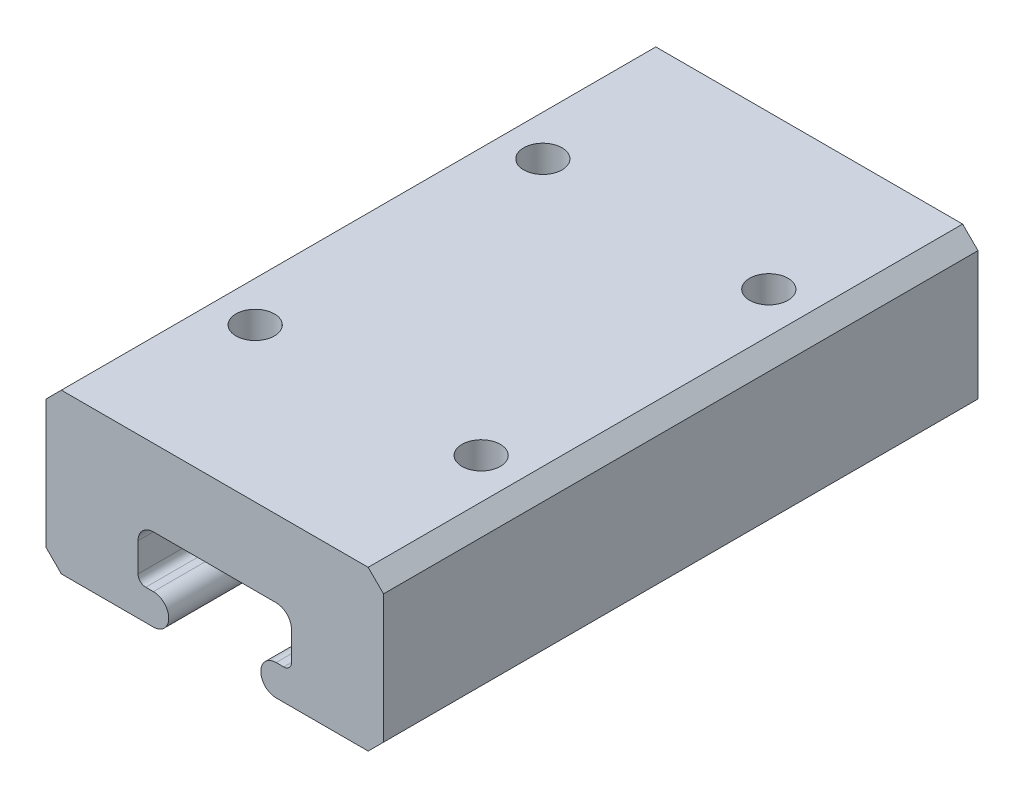
ISO-10303-21;
HEADER;
FILE_DESCRIPTION(('STEP AP214'),'2;1');
FILE_NAME('part.step','',(''),(''),'','','');
FILE_SCHEMA(('AUTOMOTIVE_DESIGN { 1 0 10303 214 1 1 1 1 }'));
ENDSEC;
DATA;
#1=APPLICATION_CONTEXT('core data for automotive mechanical design processes');
#2=APPLICATION_PROTOCOL_DEFINITION('international standard','automotive_design',2000,#1);
#3=PRODUCT_CONTEXT('',#1,'mechanical');
#4=PRODUCT('Part','Part','',(#3));
#5=PRODUCT_RELATED_PRODUCT_CATEGORY('part','',(#4));
#6=PRODUCT_DEFINITION_FORMATION('','',#4);
#7=PRODUCT_DEFINITION_CONTEXT('part definition',#1,'design');
#8=PRODUCT_DEFINITION('design','',#6,#7);
#9=PRODUCT_DEFINITION_SHAPE('','',#8);
#10=(LENGTH_UNIT() NAMED_UNIT(*) SI_UNIT(.MILLI.,.METRE.));
#11=(NAMED_UNIT(*) PLANE_ANGLE_UNIT() SI_UNIT($,.RADIAN.));
#12=(NAMED_UNIT(*) SI_UNIT($,.STERADIAN.) SOLID_ANGLE_UNIT());
#13=UNCERTAINTY_MEASURE_WITH_UNIT(LENGTH_MEASURE(1.E-05),#10,'distance_accuracy_value','');
#14=(GEOMETRIC_REPRESENTATION_CONTEXT(3) GLOBAL_UNCERTAINTY_ASSIGNED_CONTEXT((#13)) GLOBAL_UNIT_ASSIGNED_CONTEXT((#10,
#11,#12)) REPRESENTATION_CONTEXT('',''));
#15=CARTESIAN_POINT('',(0.,0.,0.));
#16=DIRECTION('',(0.,0.,1.));
#17=DIRECTION('',(1.,0.,0.));
#18=AXIS2_PLACEMENT_3D('',#15,#16,#17);
#19=CARTESIAN_POINT('',(8.,6.75,77.5));
#20=DIRECTION('',(0.,0.,-1.));
#21=DIRECTION('',(-1.,0.,0.));
#22=AXIS2_PLACEMENT_3D('',#19,#20,#21);
#23=CYLINDRICAL_SURFACE('',#22,2.);
#24=CARTESIAN_POINT('',(8.,6.75,0.));
#25=DIRECTION('',(0.,0.,-1.));
#26=DIRECTION('',(1.,0.,0.));
#27=AXIS2_PLACEMENT_3D('',#24,#25,#26);
#28=CIRCLE('',#27,2.);
#29=CARTESIAN_POINT('',(7.99999999999998,8.75,0.));
#30=VERTEX_POINT('',#29);
#31=CARTESIAN_POINT('',(10.,6.74999999999999,0.));
#32=VERTEX_POINT('',#31);
#33=EDGE_CURVE('E211',#30,#32,#28,.T.);
#34=ORIENTED_EDGE('',*,*,#33,.T.);
#35=DIRECTION('',(0.,0.,-1.));
#36=VECTOR('',#35,1.);
#37=CARTESIAN_POINT('',(10.,6.74999999999999,77.5));
#38=LINE('',#37,#36);
#39=CARTESIAN_POINT('',(10.,6.74999999999999,77.5));
#40=VERTEX_POINT('',#39);
#41=EDGE_CURVE('E190',#40,#32,#38,.T.);
#42=ORIENTED_EDGE('',*,*,#41,.F.);
#43=CARTESIAN_POINT('',(8.,6.75,77.5));
#44=DIRECTION('',(0.,0.,-1.));
#45=DIRECTION('',(1.,0.,0.));
#46=AXIS2_PLACEMENT_3D('',#43,#44,#45);
#47=CIRCLE('',#46,2.);
#48=CARTESIAN_POINT('',(7.99999999999998,8.75,77.5));
#49=VERTEX_POINT('',#48);
#50=EDGE_CURVE('E197',#49,#40,#47,.T.);
#51=ORIENTED_EDGE('',*,*,#50,.F.);
#52=DIRECTION('',(0.,0.,-1.));
#53=VECTOR('',#52,1.);
#54=CARTESIAN_POINT('',(7.99999999999998,8.75,77.5));
#55=LINE('',#54,#53);
#56=EDGE_CURVE('E308',#49,#30,#55,.T.);
#57=ORIENTED_EDGE('',*,*,#56,.T.);
#58=EDGE_LOOP('',(#34,#42,#51,#57));
#59=FACE_BOUND('',#58,.T.);
#60=ADVANCED_FACE('F47',(#59),#23,.F.);
#61=CARTESIAN_POINT('',(10.,3.00000000000001,77.5));
#62=DIRECTION('',(1.,0.,0.));
#63=DIRECTION('',(0.,0.,-1.));
#64=AXIS2_PLACEMENT_3D('',#61,#62,#63);
#65=PLANE('',#64);
#66=DIRECTION('',(0.,-1.,0.));
#67=VECTOR('',#66,1.);
#68=CARTESIAN_POINT('',(10.,3.00000000000001,0.));
#69=LINE('',#68,#67);
#70=CARTESIAN_POINT('',(10.,3.00000000000001,0.));
#71=VERTEX_POINT('',#70);
#72=EDGE_CURVE('E363',#32,#71,#69,.T.);
#73=ORIENTED_EDGE('',*,*,#72,.T.);
#74=DIRECTION('',(0.,0.,-1.));
#75=VECTOR('',#74,1.);
#76=CARTESIAN_POINT('',(10.,3.00000000000001,77.5));
#77=LINE('',#76,#75);
#78=CARTESIAN_POINT('',(10.,3.00000000000001,77.5));
#79=VERTEX_POINT('',#78);
#80=EDGE_CURVE('E193',#79,#71,#77,.T.);
#81=ORIENTED_EDGE('',*,*,#80,.F.);
#82=DIRECTION('',(0.,-1.,0.));
#83=VECTOR('',#82,1.);
#84=CARTESIAN_POINT('',(10.,3.00000000000001,77.5));
#85=LINE('',#84,#83);
#86=EDGE_CURVE('E186',#40,#79,#85,.T.);
#87=ORIENTED_EDGE('',*,*,#86,.F.);
#88=ORIENTED_EDGE('',*,*,#41,.T.);
#89=EDGE_LOOP('',(#73,#81,#87,#88));
#90=FACE_BOUND('',#89,.T.);
#91=ADVANCED_FACE('F188',(#90),#65,.F.);
#92=CARTESIAN_POINT('',(9.,3.,77.5));
#93=DIRECTION('',(0.,0.,-1.));
#94=DIRECTION('',(-1.,0.,0.));
#95=AXIS2_PLACEMENT_3D('',#92,#93,#94);
#96=CYLINDRICAL_SURFACE('',#95,1.);
#97=CARTESIAN_POINT('',(9.,3.,0.));
#98=DIRECTION('',(0.,0.,-1.));
#99=DIRECTION('',(1.,0.,0.));
#100=AXIS2_PLACEMENT_3D('',#97,#98,#99);
#101=CIRCLE('',#100,1.);
#102=CARTESIAN_POINT('',(8.99999999999999,2.,0.));
#103=VERTEX_POINT('',#102);
#104=EDGE_CURVE('E355',#71,#103,#101,.T.);
#105=ORIENTED_EDGE('',*,*,#104,.T.);
#106=DIRECTION('',(0.,0.,-1.));
#107=VECTOR('',#106,1.);
#108=CARTESIAN_POINT('',(8.99999999999999,2.,77.5));
#109=LINE('',#108,#107);
#110=CARTESIAN_POINT('',(8.99999999999999,2.,77.5));
#111=VERTEX_POINT('',#110);
#112=EDGE_CURVE('E220',#111,#103,#109,.T.);
#113=ORIENTED_EDGE('',*,*,#112,.F.);
#114=CARTESIAN_POINT('',(9.,3.,77.5));
#115=DIRECTION('',(0.,0.,-1.));
#116=DIRECTION('',(1.,0.,0.));
#117=AXIS2_PLACEMENT_3D('',#114,#115,#116);
#118=CIRCLE('',#117,1.);
#119=EDGE_CURVE('E196',#79,#111,#118,.T.);
#120=ORIENTED_EDGE('',*,*,#119,.F.);
#121=ORIENTED_EDGE('',*,*,#80,.T.);
#122=EDGE_LOOP('',(#105,#113,#120,#121));
#123=FACE_BOUND('',#122,.T.);
#124=ADVANCED_FACE('F419',(#123),#96,.F.);
#125=CARTESIAN_POINT('',(8.,2.,77.5));
#126=DIRECTION('',(0.,-1.,0.));
#127=DIRECTION('',(0.,0.,-1.));
#128=AXIS2_PLACEMENT_3D('',#125,#126,#127);
#129=PLANE('',#128);
#130=DIRECTION('',(-1.,0.,0.));
#131=VECTOR('',#130,1.);
#132=CARTESIAN_POINT('',(8.,2.,0.));
#133=LINE('',#132,#131);
#134=CARTESIAN_POINT('',(8.,2.,0.));
#135=VERTEX_POINT('',#134);
#136=EDGE_CURVE('E350',#103,#135,#133,.T.);
#137=ORIENTED_EDGE('',*,*,#136,.T.);
#138=DIRECTION('',(0.,0.,-1.));
#139=VECTOR('',#138,1.);
#140=CARTESIAN_POINT('',(8.,2.,77.5));
#141=LINE('',#140,#139);
#142=CARTESIAN_POINT('',(8.,2.,77.5));
#143=VERTEX_POINT('',#142);
#144=EDGE_CURVE('E339',#143,#135,#141,.T.);
#145=ORIENTED_EDGE('',*,*,#144,.F.);
#146=DIRECTION('',(-1.,0.,0.));
#147=VECTOR('',#146,1.);
#148=CARTESIAN_POINT('',(8.,2.,77.5));
#149=LINE('',#148,#147);
#150=EDGE_CURVE('E351',#111,#143,#149,.T.);
#151=ORIENTED_EDGE('',*,*,#150,.F.);
#152=ORIENTED_EDGE('',*,*,#112,.T.);
#153=EDGE_LOOP('',(#137,#145,#151,#152));
#154=FACE_BOUND('',#153,.T.);
#155=ADVANCED_FACE('F348',(#154),#129,.F.);
#156=CARTESIAN_POINT('',(8.,0.,77.5));
#157=DIRECTION('',(0.,0.,-1.));
#158=DIRECTION('',(-1.,0.,0.));
#159=AXIS2_PLACEMENT_3D('',#156,#157,#158);
#160=CYLINDRICAL_SURFACE('',#159,2.);
#161=CARTESIAN_POINT('',(8.,0.,0.));
#162=DIRECTION('',(0.,0.,1.));
#163=DIRECTION('',(-1.,0.,0.));
#164=AXIS2_PLACEMENT_3D('',#161,#162,#163);
#165=CIRCLE('',#164,2.);
#166=CARTESIAN_POINT('',(8.,-2.,0.));
#167=VERTEX_POINT('',#166);
#168=EDGE_CURVE('E357',#135,#167,#165,.T.);
#169=ORIENTED_EDGE('',*,*,#168,.T.);
#170=DIRECTION('',(0.,0.,-1.));
#171=VECTOR('',#170,1.);
#172=CARTESIAN_POINT('',(8.,-2.,77.5));
#173=LINE('',#172,#171);
#174=CARTESIAN_POINT('',(8.,-2.,77.5));
#175=VERTEX_POINT('',#174);
#176=EDGE_CURVE('E335',#175,#167,#173,.T.);
#177=ORIENTED_EDGE('',*,*,#176,.F.);
#178=CARTESIAN_POINT('',(8.,0.,77.5));
#179=DIRECTION('',(0.,0.,1.));
#180=DIRECTION('',(-1.,0.,0.));
#181=AXIS2_PLACEMENT_3D('',#178,#179,#180);
#182=CIRCLE('',#181,2.);
#183=EDGE_CURVE('E390',#143,#175,#182,.T.);
#184=ORIENTED_EDGE('',*,*,#183,.F.);
#185=ORIENTED_EDGE('',*,*,#144,.T.);
#186=EDGE_LOOP('',(#169,#177,#184,#185));
#187=FACE_BOUND('',#186,.T.);
#188=ADVANCED_FACE('F427',(#187),#160,.T.);
#189=CARTESIAN_POINT('',(8.99999999999999,-2.,77.5));
#190=DIRECTION('',(0.,1.,0.));
#191=DIRECTION('',(0.,0.,1.));
#192=AXIS2_PLACEMENT_3D('',#189,#190,#191);
#193=PLANE('',#192);
#194=DIRECTION('',(1.,0.,0.));
#195=VECTOR('',#194,1.);
#196=CARTESIAN_POINT('',(8.99999999999999,-2.,0.));
#197=LINE('',#196,#195);
#198=CARTESIAN_POINT('',(20.,-2.,0.));
#199=VERTEX_POINT('',#198);
#200=EDGE_CURVE('E285',#167,#199,#197,.T.);
#201=ORIENTED_EDGE('',*,*,#200,.T.);
#202=DIRECTION('',(0.,0.,1.));
#203=VECTOR('',#202,1.);
#204=CARTESIAN_POINT('',(20.,-2.,77.5));
#205=LINE('',#204,#203);
#206=CARTESIAN_POINT('',(20.,-2.,77.5));
#207=VERTEX_POINT('',#206);
#208=EDGE_CURVE('E260',#199,#207,#205,.T.);
#209=ORIENTED_EDGE('',*,*,#208,.T.);
#210=DIRECTION('',(1.,0.,0.));
#211=VECTOR('',#210,1.);
#212=CARTESIAN_POINT('',(8.,-2.,77.5));
#213=LINE('',#212,#211);
#214=EDGE_CURVE('E380',#175,#207,#213,.T.);
#215=ORIENTED_EDGE('',*,*,#214,.F.);
#216=ORIENTED_EDGE('',*,*,#176,.T.);
#217=EDGE_LOOP('',(#201,#209,#215,#216));
#218=FACE_BOUND('',#217,.T.);
#219=ADVANCED_FACE('F370',(#218),#193,.F.);
#220=CARTESIAN_POINT('',(22.,-2.,77.5));
#221=DIRECTION('',(-1.,0.,0.));
#222=DIRECTION('',(0.,0.,1.));
#223=AXIS2_PLACEMENT_3D('',#220,#221,#222);
#224=PLANE('',#223);
#225=DIRECTION('',(0.,1.,0.));
#226=VECTOR('',#225,1.);
#227=CARTESIAN_POINT('',(22.,-2.,77.5));
#228=LINE('',#227,#226);
#229=CARTESIAN_POINT('',(22.,0.,77.5));
#230=VERTEX_POINT('',#229);
#231=CARTESIAN_POINT('',(22.,16.75,77.5));
#232=VERTEX_POINT('',#231);
#233=EDGE_CURVE('E379',#230,#232,#228,.T.);
#234=ORIENTED_EDGE('',*,*,#233,.F.);
#235=DIRECTION('',(0.,0.,-1.));
#236=VECTOR('',#235,1.);
#237=CARTESIAN_POINT('',(22.,0.,77.5));
#238=LINE('',#237,#236);
#239=CARTESIAN_POINT('',(22.,0.,0.));
#240=VERTEX_POINT('',#239);
#241=EDGE_CURVE('E256',#230,#240,#238,.T.);
#242=ORIENTED_EDGE('',*,*,#241,.T.);
#243=DIRECTION('',(0.,1.,0.));
#244=VECTOR('',#243,1.);
#245=CARTESIAN_POINT('',(22.,-2.,0.));
#246=LINE('',#245,#244);
#247=CARTESIAN_POINT('',(22.,16.75,0.));
#248=VERTEX_POINT('',#247);
#249=EDGE_CURVE('E278',#240,#248,#246,.T.);
#250=ORIENTED_EDGE('',*,*,#249,.T.);
#251=DIRECTION('',(0.,0.,1.));
#252=VECTOR('',#251,1.);
#253=CARTESIAN_POINT('',(22.,16.75,77.5));
#254=LINE('',#253,#252);
#255=EDGE_CURVE('E253',#248,#232,#254,.T.);
#256=ORIENTED_EDGE('',*,*,#255,.T.);
#257=EDGE_LOOP('',(#234,#242,#250,#256));
#258=FACE_BOUND('',#257,.T.);
#259=ADVANCED_FACE('F382',(#258),#224,.F.);
#260=CARTESIAN_POINT('',(-22.,18.75,77.5));
#261=DIRECTION('',(0.,-1.,0.));
#262=DIRECTION('',(1.,0.,0.));
#263=AXIS2_PLACEMENT_3D('',#260,#261,#262);
#264=PLANE('',#263);
#265=CARTESIAN_POINT('',(14.7286790709398,18.75,20.));
#266=DIRECTION('',(0.,1.,0.));
#267=DIRECTION('',(-1.,0.,0.));
#268=AXIS2_PLACEMENT_3D('',#265,#266,#267);
#269=CIRCLE('',#268,2.5);
#270=CARTESIAN_POINT('',(12.2286790709398,18.75,20.));
#271=VERTEX_POINT('',#270);
#272=EDGE_CURVE('E665',#271,#271,#269,.T.);
#273=ORIENTED_EDGE('',*,*,#272,.F.);
#274=EDGE_LOOP('',(#273));
#275=FACE_BOUND('',#274,.T.);
#276=CARTESIAN_POINT('',(-14.7286790709397,18.75,57.5));
#277=DIRECTION('',(0.,1.,0.));
#278=DIRECTION('',(1.,0.,0.));
#279=AXIS2_PLACEMENT_3D('',#276,#277,#278);
#280=CIRCLE('',#279,2.5);
#281=CARTESIAN_POINT('',(-12.2286790709397,18.75,57.5));
#282=VERTEX_POINT('',#281);
#283=EDGE_CURVE('E666',#282,#282,#280,.T.);
#284=ORIENTED_EDGE('',*,*,#283,.F.);
#285=EDGE_LOOP('',(#284));
#286=FACE_BOUND('',#285,.T.);
#287=CARTESIAN_POINT('',(-14.7286790709397,18.75,20.));
#288=DIRECTION('',(0.,1.,0.));
#289=DIRECTION('',(1.,0.,0.));
#290=AXIS2_PLACEMENT_3D('',#287,#288,#289);
#291=CIRCLE('',#290,2.5);
#292=CARTESIAN_POINT('',(-12.2286790709397,18.75,20.));
#293=VERTEX_POINT('',#292);
#294=EDGE_CURVE('E681',#293,#293,#291,.T.);
#295=ORIENTED_EDGE('',*,*,#294,.F.);
#296=EDGE_LOOP('',(#295));
#297=FACE_BOUND('',#296,.T.);
#298=CARTESIAN_POINT('',(14.7286790709398,18.75,57.5));
#299=DIRECTION('',(0.,1.,0.));
#300=DIRECTION('',(-1.,0.,0.));
#301=AXIS2_PLACEMENT_3D('',#298,#299,#300);
#302=CIRCLE('',#301,2.5);
#303=CARTESIAN_POINT('',(12.2286790709398,18.75,57.5));
#304=VERTEX_POINT('',#303);
#305=EDGE_CURVE('E671',#304,#304,#302,.T.);
#306=ORIENTED_EDGE('',*,*,#305,.F.);
#307=EDGE_LOOP('',(#306));
#308=FACE_BOUND('',#307,.T.);
#309=DIRECTION('',(-1.,0.,0.));
#310=VECTOR('',#309,1.);
#311=CARTESIAN_POINT('',(-22.,18.75,0.));
#312=LINE('',#311,#310);
#313=CARTESIAN_POINT('',(20.,18.75,0.));
#314=VERTEX_POINT('',#313);
#315=CARTESIAN_POINT('',(-20.,18.75,0.));
#316=VERTEX_POINT('',#315);
#317=EDGE_CURVE('E267',#314,#316,#312,.T.);
#318=ORIENTED_EDGE('',*,*,#317,.T.);
#319=DIRECTION('',(0.,0.,1.));
#320=VECTOR('',#319,1.);
#321=CARTESIAN_POINT('',(-20.,18.75,77.5));
#322=LINE('',#321,#320);
#323=CARTESIAN_POINT('',(-20.,18.75,77.5));
#324=VERTEX_POINT('',#323);
#325=EDGE_CURVE('E11',#316,#324,#322,.T.);
#326=ORIENTED_EDGE('',*,*,#325,.T.);
#327=DIRECTION('',(-1.,0.,0.));
#328=VECTOR('',#327,1.);
#329=CARTESIAN_POINT('',(-22.,18.75,77.5));
#330=LINE('',#329,#328);
#331=CARTESIAN_POINT('',(20.,18.75,77.5));
#332=VERTEX_POINT('',#331);
#333=EDGE_CURVE('E268',#332,#324,#330,.T.);
#334=ORIENTED_EDGE('',*,*,#333,.F.);
#335=DIRECTION('',(0.,0.,-1.));
#336=VECTOR('',#335,1.);
#337=CARTESIAN_POINT('',(20.,18.75,77.5));
#338=LINE('',#337,#336);
#339=EDGE_CURVE('E57',#332,#314,#338,.T.);
#340=ORIENTED_EDGE('',*,*,#339,.T.);
#341=EDGE_LOOP('',(#318,#326,#334,#340));
#342=FACE_BOUND('',#341,.T.);
#343=ADVANCED_FACE('F266',(#275,#286,#297,#308,#342),#264,.F.);
#344=CARTESIAN_POINT('',(-22.,-2.,77.5));
#345=DIRECTION('',(1.,0.,0.));
#346=DIRECTION('',(0.,0.,-1.));
#347=AXIS2_PLACEMENT_3D('',#344,#345,#346);
#348=PLANE('',#347);
#349=DIRECTION('',(0.,-1.,0.));
#350=VECTOR('',#349,1.);
#351=CARTESIAN_POINT('',(-22.,-2.,0.));
#352=LINE('',#351,#350);
#353=CARTESIAN_POINT('',(-22.,16.75,0.));
#354=VERTEX_POINT('',#353);
#355=CARTESIAN_POINT('',(-22.,0.,0.));
#356=VERTEX_POINT('',#355);
#357=EDGE_CURVE('E277',#354,#356,#352,.T.);
#358=ORIENTED_EDGE('',*,*,#357,.T.);
#359=DIRECTION('',(0.,0.,1.));
#360=VECTOR('',#359,1.);
#361=CARTESIAN_POINT('',(-22.,0.,77.5));
#362=LINE('',#361,#360);
#363=CARTESIAN_POINT('',(-22.,0.,77.5));
#364=VERTEX_POINT('',#363);
#365=EDGE_CURVE('E239',#356,#364,#362,.T.);
#366=ORIENTED_EDGE('',*,*,#365,.T.);
#367=DIRECTION('',(0.,-1.,0.));
#368=VECTOR('',#367,1.);
#369=CARTESIAN_POINT('',(-22.,-2.,77.5));
#370=LINE('',#369,#368);
#371=CARTESIAN_POINT('',(-22.,16.75,77.5));
#372=VERTEX_POINT('',#371);
#373=EDGE_CURVE('E388',#372,#364,#370,.T.);
#374=ORIENTED_EDGE('',*,*,#373,.F.);
#375=DIRECTION('',(0.,0.,-1.));
#376=VECTOR('',#375,1.);
#377=CARTESIAN_POINT('',(-22.,16.75,77.5));
#378=LINE('',#377,#376);
#379=EDGE_CURVE('E235',#372,#354,#378,.T.);
#380=ORIENTED_EDGE('',*,*,#379,.T.);
#381=EDGE_LOOP('',(#358,#366,#374,#380));
#382=FACE_BOUND('',#381,.T.);
#383=ADVANCED_FACE('F471',(#382),#348,.F.);
#384=CARTESIAN_POINT('',(-8.,-2.,77.5));
#385=DIRECTION('',(0.,1.,0.));
#386=DIRECTION('',(0.,0.,1.));
#387=AXIS2_PLACEMENT_3D('',#384,#385,#386);
#388=PLANE('',#387);
#389=DIRECTION('',(1.,0.,0.));
#390=VECTOR('',#389,1.);
#391=CARTESIAN_POINT('',(-8.99999999999999,-2.,77.5));
#392=LINE('',#391,#390);
#393=CARTESIAN_POINT('',(-20.,-2.,77.5));
#394=VERTEX_POINT('',#393);
#395=CARTESIAN_POINT('',(-8.,-2.,77.5));
#396=VERTEX_POINT('',#395);
#397=EDGE_CURVE('E396',#394,#396,#392,.T.);
#398=ORIENTED_EDGE('',*,*,#397,.F.);
#399=DIRECTION('',(0.,0.,-1.));
#400=VECTOR('',#399,1.);
#401=CARTESIAN_POINT('',(-20.,-2.,77.5));
#402=LINE('',#401,#400);
#403=CARTESIAN_POINT('',(-20.,-2.,0.));
#404=VERTEX_POINT('',#403);
#405=EDGE_CURVE('E213',#394,#404,#402,.T.);
#406=ORIENTED_EDGE('',*,*,#405,.T.);
#407=DIRECTION('',(1.,0.,0.));
#408=VECTOR('',#407,1.);
#409=CARTESIAN_POINT('',(-8.,-2.,0.));
#410=LINE('',#409,#408);
#411=CARTESIAN_POINT('',(-8.,-2.,0.));
#412=VERTEX_POINT('',#411);
#413=EDGE_CURVE('E283',#404,#412,#410,.T.);
#414=ORIENTED_EDGE('',*,*,#413,.T.);
#415=DIRECTION('',(0.,0.,-1.));
#416=VECTOR('',#415,1.);
#417=CARTESIAN_POINT('',(-8.,-2.,77.5));
#418=LINE('',#417,#416);
#419=EDGE_CURVE('E331',#396,#412,#418,.T.);
#420=ORIENTED_EDGE('',*,*,#419,.F.);
#421=EDGE_LOOP('',(#398,#406,#414,#420));
#422=FACE_BOUND('',#421,.T.);
#423=ADVANCED_FACE('F477',(#422),#388,.F.);
#424=CARTESIAN_POINT('',(-8.,0.,77.5));
#425=DIRECTION('',(0.,0.,-1.));
#426=DIRECTION('',(-1.,0.,0.));
#427=AXIS2_PLACEMENT_3D('',#424,#425,#426);
#428=CYLINDRICAL_SURFACE('',#427,2.);
#429=CARTESIAN_POINT('',(-8.,0.,0.));
#430=DIRECTION('',(0.,0.,1.));
#431=DIRECTION('',(1.,0.,0.));
#432=AXIS2_PLACEMENT_3D('',#429,#430,#431);
#433=CIRCLE('',#432,2.);
#434=CARTESIAN_POINT('',(-8.,2.,0.));
#435=VERTEX_POINT('',#434);
#436=EDGE_CURVE('E291',#412,#435,#433,.T.);
#437=ORIENTED_EDGE('',*,*,#436,.T.);
#438=DIRECTION('',(0.,0.,-1.));
#439=VECTOR('',#438,1.);
#440=CARTESIAN_POINT('',(-8.,2.,77.5));
#441=LINE('',#440,#439);
#442=CARTESIAN_POINT('',(-8.,2.,77.5));
#443=VERTEX_POINT('',#442);
#444=EDGE_CURVE('E327',#443,#435,#441,.T.);
#445=ORIENTED_EDGE('',*,*,#444,.F.);
#446=CARTESIAN_POINT('',(-8.,0.,77.5));
#447=DIRECTION('',(0.,0.,1.));
#448=DIRECTION('',(1.,0.,0.));
#449=AXIS2_PLACEMENT_3D('',#446,#447,#448);
#450=CIRCLE('',#449,2.);
#451=EDGE_CURVE('E399',#396,#443,#450,.T.);
#452=ORIENTED_EDGE('',*,*,#451,.F.);
#453=ORIENTED_EDGE('',*,*,#419,.T.);
#454=EDGE_LOOP('',(#437,#445,#452,#453));
#455=FACE_BOUND('',#454,.T.);
#456=ADVANCED_FACE('F482',(#455),#428,.T.);
#457=CARTESIAN_POINT('',(-8.,2.,77.5));
#458=DIRECTION('',(0.,-1.,0.));
#459=DIRECTION('',(0.,0.,-1.));
#460=AXIS2_PLACEMENT_3D('',#457,#458,#459);
#461=PLANE('',#460);
#462=DIRECTION('',(-1.,0.,0.));
#463=VECTOR('',#462,1.);
#464=CARTESIAN_POINT('',(-8.,2.,0.));
#465=LINE('',#464,#463);
#466=CARTESIAN_POINT('',(-8.99999999999999,2.,0.));
#467=VERTEX_POINT('',#466);
#468=EDGE_CURVE('E294',#435,#467,#465,.T.);
#469=ORIENTED_EDGE('',*,*,#468,.T.);
#470=DIRECTION('',(0.,0.,-1.));
#471=VECTOR('',#470,1.);
#472=CARTESIAN_POINT('',(-8.99999999999999,2.,77.5));
#473=LINE('',#472,#471);
#474=CARTESIAN_POINT('',(-8.99999999999999,2.,77.5));
#475=VERTEX_POINT('',#474);
#476=EDGE_CURVE('E323',#475,#467,#473,.T.);
#477=ORIENTED_EDGE('',*,*,#476,.F.);
#478=DIRECTION('',(-1.,0.,0.));
#479=VECTOR('',#478,1.);
#480=CARTESIAN_POINT('',(-8.,2.,77.5));
#481=LINE('',#480,#479);
#482=EDGE_CURVE('E402',#443,#475,#481,.T.);
#483=ORIENTED_EDGE('',*,*,#482,.F.);
#484=ORIENTED_EDGE('',*,*,#444,.T.);
#485=EDGE_LOOP('',(#469,#477,#483,#484));
#486=FACE_BOUND('',#485,.T.);
#487=ADVANCED_FACE('F488',(#486),#461,.F.);
#488=CARTESIAN_POINT('',(-9.,3.,77.5));
#489=DIRECTION('',(0.,0.,-1.));
#490=DIRECTION('',(-1.,0.,0.));
#491=AXIS2_PLACEMENT_3D('',#488,#489,#490);
#492=CYLINDRICAL_SURFACE('',#491,1.);
#493=CARTESIAN_POINT('',(-9.,3.,0.));
#494=DIRECTION('',(0.,0.,-1.));
#495=DIRECTION('',(-1.,0.,0.));
#496=AXIS2_PLACEMENT_3D('',#493,#494,#495);
#497=CIRCLE('',#496,1.);
#498=CARTESIAN_POINT('',(-10.,3.,0.));
#499=VERTEX_POINT('',#498);
#500=EDGE_CURVE('E297',#467,#499,#497,.T.);
#501=ORIENTED_EDGE('',*,*,#500,.T.);
#502=DIRECTION('',(0.,0.,-1.));
#503=VECTOR('',#502,1.);
#504=CARTESIAN_POINT('',(-10.,3.,77.5));
#505=LINE('',#504,#503);
#506=CARTESIAN_POINT('',(-10.,3.,77.5));
#507=VERTEX_POINT('',#506);
#508=EDGE_CURVE('E319',#507,#499,#505,.T.);
#509=ORIENTED_EDGE('',*,*,#508,.F.);
#510=CARTESIAN_POINT('',(-9.,3.,77.5));
#511=DIRECTION('',(0.,0.,-1.));
#512=DIRECTION('',(-1.,0.,0.));
#513=AXIS2_PLACEMENT_3D('',#510,#511,#512);
#514=CIRCLE('',#513,1.);
#515=EDGE_CURVE('E405',#475,#507,#514,.T.);
#516=ORIENTED_EDGE('',*,*,#515,.F.);
#517=ORIENTED_EDGE('',*,*,#476,.T.);
#518=EDGE_LOOP('',(#501,#509,#516,#517));
#519=FACE_BOUND('',#518,.T.);
#520=ADVANCED_FACE('F492',(#519),#492,.F.);
#521=CARTESIAN_POINT('',(-10.,3.00000000000001,77.5));
#522=DIRECTION('',(-1.,0.,0.));
#523=DIRECTION('',(0.,0.,1.));
#524=AXIS2_PLACEMENT_3D('',#521,#522,#523);
#525=PLANE('',#524);
#526=DIRECTION('',(0.,1.,0.));
#527=VECTOR('',#526,1.);
#528=CARTESIAN_POINT('',(-10.,3.00000000000001,0.));
#529=LINE('',#528,#527);
#530=CARTESIAN_POINT('',(-10.,6.74999999999999,0.));
#531=VERTEX_POINT('',#530);
#532=EDGE_CURVE('E300',#499,#531,#529,.T.);
#533=ORIENTED_EDGE('',*,*,#532,.T.);
#534=DIRECTION('',(0.,0.,-1.));
#535=VECTOR('',#534,1.);
#536=CARTESIAN_POINT('',(-10.,6.74999999999999,77.5));
#537=LINE('',#536,#535);
#538=CARTESIAN_POINT('',(-10.,6.74999999999999,77.5));
#539=VERTEX_POINT('',#538);
#540=EDGE_CURVE('E315',#539,#531,#537,.T.);
#541=ORIENTED_EDGE('',*,*,#540,.F.);
#542=DIRECTION('',(0.,1.,0.));
#543=VECTOR('',#542,1.);
#544=CARTESIAN_POINT('',(-10.,3.00000000000001,77.5));
#545=LINE('',#544,#543);
#546=EDGE_CURVE('E408',#507,#539,#545,.T.);
#547=ORIENTED_EDGE('',*,*,#546,.F.);
#548=ORIENTED_EDGE('',*,*,#508,.T.);
#549=EDGE_LOOP('',(#533,#541,#547,#548));
#550=FACE_BOUND('',#549,.T.);
#551=ADVANCED_FACE('F497',(#550),#525,.F.);
#552=CARTESIAN_POINT('',(-8.,6.75,77.5));
#553=DIRECTION('',(0.,0.,-1.));
#554=DIRECTION('',(-1.,0.,0.));
#555=AXIS2_PLACEMENT_3D('',#552,#553,#554);
#556=CYLINDRICAL_SURFACE('',#555,2.);
#557=CARTESIAN_POINT('',(-8.,6.75,0.));
#558=DIRECTION('',(0.,0.,-1.));
#559=DIRECTION('',(1.,0.,0.));
#560=AXIS2_PLACEMENT_3D('',#557,#558,#559);
#561=CIRCLE('',#560,2.);
#562=CARTESIAN_POINT('',(-7.99999999999999,8.75,0.));
#563=VERTEX_POINT('',#562);
#564=EDGE_CURVE('E303',#531,#563,#561,.T.);
#565=ORIENTED_EDGE('',*,*,#564,.T.);
#566=DIRECTION('',(0.,0.,-1.));
#567=VECTOR('',#566,1.);
#568=CARTESIAN_POINT('',(-7.99999999999999,8.75,77.5));
#569=LINE('',#568,#567);
#570=CARTESIAN_POINT('',(-7.99999999999999,8.75,77.5));
#571=VERTEX_POINT('',#570);
#572=EDGE_CURVE('E311',#571,#563,#569,.T.);
#573=ORIENTED_EDGE('',*,*,#572,.F.);
#574=CARTESIAN_POINT('',(-8.,6.75,77.5));
#575=DIRECTION('',(0.,0.,-1.));
#576=DIRECTION('',(1.,0.,0.));
#577=AXIS2_PLACEMENT_3D('',#574,#575,#576);
#578=CIRCLE('',#577,2.);
#579=EDGE_CURVE('E411',#539,#571,#578,.T.);
#580=ORIENTED_EDGE('',*,*,#579,.F.);
#581=ORIENTED_EDGE('',*,*,#540,.T.);
#582=EDGE_LOOP('',(#565,#573,#580,#581));
#583=FACE_BOUND('',#582,.T.);
#584=ADVANCED_FACE('F501',(#583),#556,.F.);
#585=CARTESIAN_POINT('',(-7.99999999999999,8.75,77.5));
#586=DIRECTION('',(0.,1.,0.));
#587=DIRECTION('',(0.,0.,1.));
#588=AXIS2_PLACEMENT_3D('',#585,#586,#587);
#589=PLANE('',#588);
#590=DIRECTION('',(1.,0.,0.));
#591=VECTOR('',#590,1.);
#592=CARTESIAN_POINT('',(-7.99999999999999,8.75,0.));
#593=LINE('',#592,#591);
#594=EDGE_CURVE('E208',#563,#30,#593,.T.);
#595=ORIENTED_EDGE('',*,*,#594,.T.);
#596=ORIENTED_EDGE('',*,*,#56,.F.);
#597=DIRECTION('',(1.,0.,0.));
#598=VECTOR('',#597,1.);
#599=CARTESIAN_POINT('',(-7.99999999999999,8.75,77.5));
#600=LINE('',#599,#598);
#601=EDGE_CURVE('E203',#571,#49,#600,.T.);
#602=ORIENTED_EDGE('',*,*,#601,.F.);
#603=ORIENTED_EDGE('',*,*,#572,.T.);
#604=EDGE_LOOP('',(#595,#596,#602,#603));
#605=FACE_BOUND('',#604,.T.);
#606=ADVANCED_FACE('F505',(#605),#589,.F.);
#607=CARTESIAN_POINT('',(8.,6.75,77.5));
#608=DIRECTION('',(0.,0.,1.));
#609=DIRECTION('',(1.,0.,0.));
#610=AXIS2_PLACEMENT_3D('',#607,#608,#609);
#611=PLANE('',#610);
#612=ORIENTED_EDGE('',*,*,#373,.T.);
#613=DIRECTION('',(-0.707106781186548,0.707106781186548,0.));
#614=VECTOR('',#613,1.);
#615=CARTESIAN_POINT('',(-10.375,-11.625,77.5));
#616=LINE('',#615,#614);
#617=EDGE_CURVE('E250',#364,#394,#616,.F.);
#618=ORIENTED_EDGE('',*,*,#617,.T.);
#619=ORIENTED_EDGE('',*,*,#397,.T.);
#620=ORIENTED_EDGE('',*,*,#451,.T.);
#621=ORIENTED_EDGE('',*,*,#482,.T.);
#622=ORIENTED_EDGE('',*,*,#515,.T.);
#623=ORIENTED_EDGE('',*,*,#546,.T.);
#624=ORIENTED_EDGE('',*,*,#579,.T.);
#625=ORIENTED_EDGE('',*,*,#601,.T.);
#626=ORIENTED_EDGE('',*,*,#50,.T.);
#627=ORIENTED_EDGE('',*,*,#86,.T.);
#628=ORIENTED_EDGE('',*,*,#119,.T.);
#629=ORIENTED_EDGE('',*,*,#150,.T.);
#630=ORIENTED_EDGE('',*,*,#183,.T.);
#631=ORIENTED_EDGE('',*,*,#214,.T.);
#632=DIRECTION('',(-0.707106781186548,-0.707106781186548,0.));
#633=VECTOR('',#632,1.);
#634=CARTESIAN_POINT('',(18.375,-3.625,77.5));
#635=LINE('',#634,#633);
#636=EDGE_CURVE('E247',#207,#230,#635,.F.);
#637=ORIENTED_EDGE('',*,*,#636,.T.);
#638=ORIENTED_EDGE('',*,*,#233,.T.);
#639=DIRECTION('',(0.707106781186548,-0.707106781186548,0.));
#640=VECTOR('',#639,1.);
#641=CARTESIAN_POINT('',(20.,18.75,77.5));
#642=LINE('',#641,#640);
#643=EDGE_CURVE('E69',#232,#332,#642,.F.);
#644=ORIENTED_EDGE('',*,*,#643,.T.);
#645=ORIENTED_EDGE('',*,*,#333,.T.);
#646=DIRECTION('',(0.707106781186548,0.707106781186548,0.));
#647=VECTOR('',#646,1.);
#648=CARTESIAN_POINT('',(-12.,26.75,77.5));
#649=LINE('',#648,#647);
#650=EDGE_CURVE('E244',#324,#372,#649,.F.);
#651=ORIENTED_EDGE('',*,*,#650,.T.);
#652=EDGE_LOOP('',(#612,#618,#619,#620,#621,#622,#623,#624,#625,#626,#627,#628,#629,#630,#631,
#637,#638,#644,#645,#651));
#653=FACE_BOUND('',#652,.T.);
#654=ADVANCED_FACE('F201',(#653),#611,.T.);
#655=CARTESIAN_POINT('',(8.,6.75,0.));
#656=DIRECTION('',(0.,0.,1.));
#657=DIRECTION('',(1.,0.,0.));
#658=AXIS2_PLACEMENT_3D('',#655,#656,#657);
#659=PLANE('',#658);
#660=ORIENTED_EDGE('',*,*,#413,.F.);
#661=DIRECTION('',(0.707106781186548,-0.707106781186548,0.));
#662=VECTOR('',#661,1.);
#663=CARTESIAN_POINT('',(-20.,-2.,0.));
#664=LINE('',#663,#662);
#665=EDGE_CURVE('E232',#404,#356,#664,.F.);
#666=ORIENTED_EDGE('',*,*,#665,.T.);
#667=ORIENTED_EDGE('',*,*,#357,.F.);
#668=DIRECTION('',(-0.707106781186548,-0.707106781186548,0.));
#669=VECTOR('',#668,1.);
#670=CARTESIAN_POINT('',(-22.,16.75,0.));
#671=LINE('',#670,#669);
#672=EDGE_CURVE('E226',#354,#316,#671,.F.);
#673=ORIENTED_EDGE('',*,*,#672,.T.);
#674=ORIENTED_EDGE('',*,*,#317,.F.);
#675=DIRECTION('',(-0.707106781186548,0.707106781186548,0.));
#676=VECTOR('',#675,1.);
#677=CARTESIAN_POINT('',(20.,18.75,0.));
#678=LINE('',#677,#676);
#679=EDGE_CURVE('E218',#314,#248,#678,.F.);
#680=ORIENTED_EDGE('',*,*,#679,.T.);
#681=ORIENTED_EDGE('',*,*,#249,.F.);
#682=DIRECTION('',(0.707106781186548,0.707106781186548,0.));
#683=VECTOR('',#682,1.);
#684=CARTESIAN_POINT('',(22.,0.,0.));
#685=LINE('',#684,#683);
#686=EDGE_CURVE('E229',#240,#199,#685,.F.);
#687=ORIENTED_EDGE('',*,*,#686,.T.);
#688=ORIENTED_EDGE('',*,*,#200,.F.);
#689=ORIENTED_EDGE('',*,*,#168,.F.);
#690=ORIENTED_EDGE('',*,*,#136,.F.);
#691=ORIENTED_EDGE('',*,*,#104,.F.);
#692=ORIENTED_EDGE('',*,*,#72,.F.);
#693=ORIENTED_EDGE('',*,*,#33,.F.);
#694=ORIENTED_EDGE('',*,*,#594,.F.);
#695=ORIENTED_EDGE('',*,*,#564,.F.);
#696=ORIENTED_EDGE('',*,*,#532,.F.);
#697=ORIENTED_EDGE('',*,*,#500,.F.);
#698=ORIENTED_EDGE('',*,*,#468,.F.);
#699=ORIENTED_EDGE('',*,*,#436,.F.);
#700=EDGE_LOOP('',(#660,#666,#667,#673,#674,#680,#681,#687,#688,#689,#690,#691,#692,#693,#694,
#695,#696,#697,#698,#699));
#701=FACE_BOUND('',#700,.T.);
#702=ADVANCED_FACE('F272',(#701),#659,.F.);
#703=CARTESIAN_POINT('',(-20.,-2.,77.5));
#704=DIRECTION('',(0.707106781186547,0.707106781186547,0.));
#705=DIRECTION('',(0.,0.,-1.));
#706=AXIS2_PLACEMENT_3D('',#703,#704,#705);
#707=PLANE('',#706);
#708=ORIENTED_EDGE('',*,*,#617,.F.);
#709=ORIENTED_EDGE('',*,*,#365,.F.);
#710=ORIENTED_EDGE('',*,*,#665,.F.);
#711=ORIENTED_EDGE('',*,*,#405,.F.);
#712=EDGE_LOOP('',(#708,#709,#710,#711));
#713=FACE_BOUND('',#712,.T.);
#714=ADVANCED_FACE('F446',(#713),#707,.F.);
#715=CARTESIAN_POINT('',(22.,0.,77.5));
#716=DIRECTION('',(-0.707106781186547,0.707106781186547,0.));
#717=DIRECTION('',(0.,0.,-1.));
#718=AXIS2_PLACEMENT_3D('',#715,#716,#717);
#719=PLANE('',#718);
#720=ORIENTED_EDGE('',*,*,#636,.F.);
#721=ORIENTED_EDGE('',*,*,#208,.F.);
#722=ORIENTED_EDGE('',*,*,#686,.F.);
#723=ORIENTED_EDGE('',*,*,#241,.F.);
#724=EDGE_LOOP('',(#720,#721,#722,#723));
#725=FACE_BOUND('',#724,.T.);
#726=ADVANCED_FACE('F376',(#725),#719,.F.);
#727=CARTESIAN_POINT('',(-22.,16.75,77.5));
#728=DIRECTION('',(0.707106781186547,-0.707106781186547,0.));
#729=DIRECTION('',(0.,0.,-1.));
#730=AXIS2_PLACEMENT_3D('',#727,#728,#729);
#731=PLANE('',#730);
#732=ORIENTED_EDGE('',*,*,#650,.F.);
#733=ORIENTED_EDGE('',*,*,#325,.F.);
#734=ORIENTED_EDGE('',*,*,#672,.F.);
#735=ORIENTED_EDGE('',*,*,#379,.F.);
#736=EDGE_LOOP('',(#732,#733,#734,#735));
#737=FACE_BOUND('',#736,.T.);
#738=ADVANCED_FACE('F457',(#737),#731,.F.);
#739=CARTESIAN_POINT('',(20.,18.75,77.5));
#740=DIRECTION('',(-0.707106781186547,-0.707106781186547,0.));
#741=DIRECTION('',(0.,0.,-1.));
#742=AXIS2_PLACEMENT_3D('',#739,#740,#741);
#743=PLANE('',#742);
#744=ORIENTED_EDGE('',*,*,#643,.F.);
#745=ORIENTED_EDGE('',*,*,#255,.F.);
#746=ORIENTED_EDGE('',*,*,#679,.F.);
#747=ORIENTED_EDGE('',*,*,#339,.F.);
#748=EDGE_LOOP('',(#744,#745,#746,#747));
#749=FACE_BOUND('',#748,.T.);
#750=ADVANCED_FACE('F50',(#749),#743,.F.);
#751=CARTESIAN_POINT('',(14.7286790709398,11.75,57.5));
#752=DIRECTION('',(0.,1.,0.));
#753=DIRECTION('',(-1.,0.,0.));
#754=AXIS2_PLACEMENT_3D('',#751,#752,#753);
#755=CYLINDRICAL_SURFACE('',#754,2.5);
#756=CARTESIAN_POINT('',(14.7286790709398,11.75,57.5));
#757=DIRECTION('',(0.,1.,0.));
#758=DIRECTION('',(-1.,0.,0.));
#759=AXIS2_PLACEMENT_3D('',#756,#757,#758);
#760=CIRCLE('',#759,2.5);
#761=CARTESIAN_POINT('',(12.2286790709398,11.75,57.5));
#762=VERTEX_POINT('',#761);
#763=EDGE_CURVE('E417',#762,#762,#760,.T.);
#764=ORIENTED_EDGE('',*,*,#763,.F.);
#765=EDGE_LOOP('',(#764));
#766=FACE_BOUND('',#765,.T.);
#767=ORIENTED_EDGE('',*,*,#305,.T.);
#768=EDGE_LOOP('',(#767));
#769=FACE_BOUND('',#768,.T.);
#770=ADVANCED_FACE('F465',(#766,#769),#755,.F.);
#771=CARTESIAN_POINT('',(14.7286790709398,11.75,57.5));
#772=DIRECTION('',(0.,1.,0.));
#773=DIRECTION('',(-1.,0.,0.));
#774=AXIS2_PLACEMENT_3D('',#771,#772,#773);
#775=PLANE('',#774);
#776=ORIENTED_EDGE('',*,*,#763,.T.);
#777=EDGE_LOOP('',(#776));
#778=FACE_BOUND('',#777,.T.);
#779=ADVANCED_FACE('F588',(#778),#775,.T.);
#780=CARTESIAN_POINT('',(-14.7286790709397,11.75,20.));
#781=DIRECTION('',(0.,1.,0.));
#782=DIRECTION('',(-1.,0.,0.));
#783=AXIS2_PLACEMENT_3D('',#780,#781,#782);
#784=CYLINDRICAL_SURFACE('',#783,2.5);
#785=CARTESIAN_POINT('',(-14.7286790709397,11.75,20.));
#786=DIRECTION('',(0.,1.,0.));
#787=DIRECTION('',(1.,0.,0.));
#788=AXIS2_PLACEMENT_3D('',#785,#786,#787);
#789=CIRCLE('',#788,2.5);
#790=CARTESIAN_POINT('',(-12.2286790709397,11.75,20.));
#791=VERTEX_POINT('',#790);
#792=EDGE_CURVE('E694',#791,#791,#789,.T.);
#793=ORIENTED_EDGE('',*,*,#792,.F.);
#794=EDGE_LOOP('',(#793));
#795=FACE_BOUND('',#794,.T.);
#796=ORIENTED_EDGE('',*,*,#294,.T.);
#797=EDGE_LOOP('',(#796));
#798=FACE_BOUND('',#797,.T.);
#799=ADVANCED_FACE('F598',(#795,#798),#784,.F.);
#800=CARTESIAN_POINT('',(-14.7286790709397,11.75,20.));
#801=DIRECTION('',(0.,-1.,0.));
#802=DIRECTION('',(1.,0.,0.));
#803=AXIS2_PLACEMENT_3D('',#800,#801,#802);
#804=PLANE('',#803);
#805=ORIENTED_EDGE('',*,*,#792,.T.);
#806=EDGE_LOOP('',(#805));
#807=FACE_BOUND('',#806,.T.);
#808=ADVANCED_FACE('F608',(#807),#804,.F.);
#809=CARTESIAN_POINT('',(-14.7286790709397,11.75,57.5));
#810=DIRECTION('',(0.,1.,0.));
#811=DIRECTION('',(-1.,0.,0.));
#812=AXIS2_PLACEMENT_3D('',#809,#810,#811);
#813=CYLINDRICAL_SURFACE('',#812,2.5);
#814=CARTESIAN_POINT('',(-14.7286790709397,11.75,57.5));
#815=DIRECTION('',(0.,1.,0.));
#816=DIRECTION('',(1.,0.,0.));
#817=AXIS2_PLACEMENT_3D('',#814,#815,#816);
#818=CIRCLE('',#817,2.5);
#819=CARTESIAN_POINT('',(-12.2286790709397,11.75,57.5));
#820=VERTEX_POINT('',#819);
#821=EDGE_CURVE('E674',#820,#820,#818,.T.);
#822=ORIENTED_EDGE('',*,*,#821,.F.);
#823=EDGE_LOOP('',(#822));
#824=FACE_BOUND('',#823,.T.);
#825=ORIENTED_EDGE('',*,*,#283,.T.);
#826=EDGE_LOOP('',(#825));
#827=FACE_BOUND('',#826,.T.);
#828=ADVANCED_FACE('F618',(#824,#827),#813,.F.);
#829=CARTESIAN_POINT('',(-14.7286790709397,11.75,57.5));
#830=DIRECTION('',(0.,-1.,0.));
#831=DIRECTION('',(1.,0.,0.));
#832=AXIS2_PLACEMENT_3D('',#829,#830,#831);
#833=PLANE('',#832);
#834=ORIENTED_EDGE('',*,*,#821,.T.);
#835=EDGE_LOOP('',(#834));
#836=FACE_BOUND('',#835,.T.);
#837=ADVANCED_FACE('F628',(#836),#833,.F.);
#838=CARTESIAN_POINT('',(14.7286790709398,11.75,20.));
#839=DIRECTION('',(0.,1.,0.));
#840=DIRECTION('',(-1.,0.,0.));
#841=AXIS2_PLACEMENT_3D('',#838,#839,#840);
#842=CYLINDRICAL_SURFACE('',#841,2.5);
#843=CARTESIAN_POINT('',(14.7286790709398,11.75,20.));
#844=DIRECTION('',(0.,1.,0.));
#845=DIRECTION('',(-1.,0.,0.));
#846=AXIS2_PLACEMENT_3D('',#843,#844,#845);
#847=CIRCLE('',#846,2.5);
#848=CARTESIAN_POINT('',(12.2286790709398,11.75,20.));
#849=VERTEX_POINT('',#848);
#850=EDGE_CURVE('E663',#849,#849,#847,.T.);
#851=ORIENTED_EDGE('',*,*,#850,.F.);
#852=EDGE_LOOP('',(#851));
#853=FACE_BOUND('',#852,.T.);
#854=ORIENTED_EDGE('',*,*,#272,.T.);
#855=EDGE_LOOP('',(#854));
#856=FACE_BOUND('',#855,.T.);
#857=ADVANCED_FACE('F638',(#853,#856),#842,.F.);
#858=CARTESIAN_POINT('',(14.7286790709398,11.75,20.));
#859=DIRECTION('',(0.,1.,0.));
#860=DIRECTION('',(-1.,0.,0.));
#861=AXIS2_PLACEMENT_3D('',#858,#859,#860);
#862=PLANE('',#861);
#863=ORIENTED_EDGE('',*,*,#850,.T.);
#864=EDGE_LOOP('',(#863));
#865=FACE_BOUND('',#864,.T.);
#866=ADVANCED_FACE('F648',(#865),#862,.T.);
#867=CLOSED_SHELL('',(#60,#91,#124,#155,#188,#219,#259,#343,#383,#423,#456,#487,#520,#551,#584,
#606,#654,#702,#714,#726,#738,#750,#770,#779,#799,#808,#828,#837,#857,#866));
#868=MANIFOLD_SOLID_BREP('B2',#867);
#869=ADVANCED_BREP_SHAPE_REPRESENTATION('',(#18,#868),#14);
#870=SHAPE_DEFINITION_REPRESENTATION(#9,#869);
ENDSEC;
END-ISO-10303-21;
